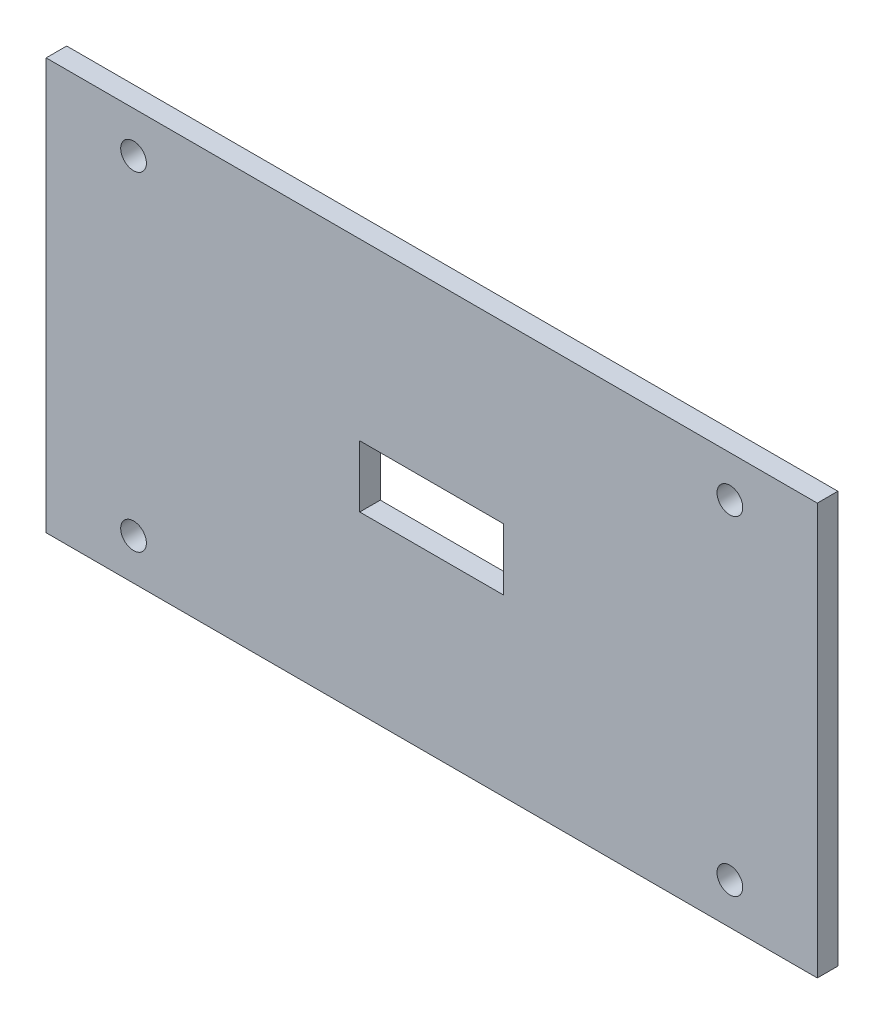
ISO-10303-21;
HEADER;
FILE_DESCRIPTION(('STEP AP214'),'2;1');
FILE_NAME('part.step','',(''),(''),'','','');
FILE_SCHEMA(('AUTOMOTIVE_DESIGN { 1 0 10303 214 1 1 1 1 }'));
ENDSEC;
DATA;
#1=APPLICATION_CONTEXT('core data for automotive mechanical design processes');
#2=APPLICATION_PROTOCOL_DEFINITION('international standard','automotive_design',2000,#1);
#3=PRODUCT_CONTEXT('',#1,'mechanical');
#4=PRODUCT('Part','Part','',(#3));
#5=PRODUCT_RELATED_PRODUCT_CATEGORY('part','',(#4));
#6=PRODUCT_DEFINITION_FORMATION('','',#4);
#7=PRODUCT_DEFINITION_CONTEXT('part definition',#1,'design');
#8=PRODUCT_DEFINITION('design','',#6,#7);
#9=PRODUCT_DEFINITION_SHAPE('','',#8);
#10=(LENGTH_UNIT() NAMED_UNIT(*) SI_UNIT(.MILLI.,.METRE.));
#11=(NAMED_UNIT(*) PLANE_ANGLE_UNIT() SI_UNIT($,.RADIAN.));
#12=(NAMED_UNIT(*) SI_UNIT($,.STERADIAN.) SOLID_ANGLE_UNIT());
#13=UNCERTAINTY_MEASURE_WITH_UNIT(LENGTH_MEASURE(1.E-05),#10,'distance_accuracy_value','');
#14=(GEOMETRIC_REPRESENTATION_CONTEXT(3) GLOBAL_UNCERTAINTY_ASSIGNED_CONTEXT((#13)) GLOBAL_UNIT_ASSIGNED_CONTEXT((#10,
#11,#12)) REPRESENTATION_CONTEXT('',''));
#15=CARTESIAN_POINT('',(0.,0.,0.));
#16=DIRECTION('',(0.,0.,1.));
#17=DIRECTION('',(1.,0.,0.));
#18=AXIS2_PLACEMENT_3D('',#15,#16,#17);
#19=CARTESIAN_POINT('',(0.,0.,4.));
#20=DIRECTION('',(0.,0.,1.));
#21=DIRECTION('',(1.,0.,0.));
#22=AXIS2_PLACEMENT_3D('',#19,#20,#21);
#23=PLANE('',#22);
#24=CARTESIAN_POINT('',(83.4442624253227,39.9499153350629,4.));
#25=DIRECTION('',(0.,0.,1.));
#26=DIRECTION('',(1.,0.,0.));
#27=AXIS2_PLACEMENT_3D('',#24,#25,#26);
#28=CIRCLE('',#27,2.50000000000001);
#29=CARTESIAN_POINT('',(85.9442624253228,39.9499153350629,4.));
#30=VERTEX_POINT('',#29);
#31=EDGE_CURVE('E127',#30,#30,#28,.T.);
#32=ORIENTED_EDGE('',*,*,#31,.F.);
#33=EDGE_LOOP('',(#32));
#34=FACE_BOUND('',#33,.T.);
#35=CARTESIAN_POINT('',(-32.5557375746772,39.9499153350629,4.));
#36=DIRECTION('',(0.,0.,1.));
#37=DIRECTION('',(1.,0.,0.));
#38=AXIS2_PLACEMENT_3D('',#35,#36,#37);
#39=CIRCLE('',#38,2.5);
#40=CARTESIAN_POINT('',(-30.0557375746772,39.9499153350629,4.));
#41=VERTEX_POINT('',#40);
#42=EDGE_CURVE('E143',#41,#41,#39,.T.);
#43=ORIENTED_EDGE('',*,*,#42,.F.);
#44=EDGE_LOOP('',(#43));
#45=FACE_BOUND('',#44,.T.);
#46=DIRECTION('',(0.,-1.,0.));
#47=VECTOR('',#46,1.);
#48=CARTESIAN_POINT('',(-49.5557375746772,47.9499153350629,4.));
#49=LINE('',#48,#47);
#50=CARTESIAN_POINT('',(-49.5557375746772,47.9499153350629,4.));
#51=VERTEX_POINT('',#50);
#52=CARTESIAN_POINT('',(-49.5557375746772,-32.0500846649371,4.));
#53=VERTEX_POINT('',#52);
#54=EDGE_CURVE('E149',#51,#53,#49,.T.);
#55=ORIENTED_EDGE('',*,*,#54,.T.);
#56=DIRECTION('',(1.,0.,0.));
#57=VECTOR('',#56,1.);
#58=CARTESIAN_POINT('',(-49.5557375746772,-32.0500846649371,4.));
#59=LINE('',#58,#57);
#60=CARTESIAN_POINT('',(100.444262425323,-32.0500846649371,4.));
#61=VERTEX_POINT('',#60);
#62=EDGE_CURVE('E152',#53,#61,#59,.T.);
#63=ORIENTED_EDGE('',*,*,#62,.T.);
#64=DIRECTION('',(0.,1.,0.));
#65=VECTOR('',#64,1.);
#66=CARTESIAN_POINT('',(100.444262425323,47.9499153350629,4.));
#67=LINE('',#66,#65);
#68=CARTESIAN_POINT('',(100.444262425323,47.9499153350629,4.));
#69=VERTEX_POINT('',#68);
#70=EDGE_CURVE('E155',#61,#69,#67,.T.);
#71=ORIENTED_EDGE('',*,*,#70,.T.);
#72=DIRECTION('',(-1.,0.,0.));
#73=VECTOR('',#72,1.);
#74=CARTESIAN_POINT('',(-49.5557375746772,47.9499153350629,4.));
#75=LINE('',#74,#73);
#76=EDGE_CURVE('E157',#69,#51,#75,.T.);
#77=ORIENTED_EDGE('',*,*,#76,.T.);
#78=EDGE_LOOP('',(#55,#63,#71,#77));
#79=FACE_BOUND('',#78,.T.);
#80=CARTESIAN_POINT('',(-32.5557375746772,-24.0500846649371,4.));
#81=DIRECTION('',(0.,0.,1.));
#82=DIRECTION('',(1.,0.,0.));
#83=AXIS2_PLACEMENT_3D('',#80,#81,#82);
#84=CIRCLE('',#83,2.5);
#85=CARTESIAN_POINT('',(-30.0557375746772,-24.0500846649371,4.));
#86=VERTEX_POINT('',#85);
#87=EDGE_CURVE('E137',#86,#86,#84,.T.);
#88=ORIENTED_EDGE('',*,*,#87,.F.);
#89=EDGE_LOOP('',(#88));
#90=FACE_BOUND('',#89,.T.);
#91=DIRECTION('',(1.,0.,0.));
#92=VECTOR('',#91,1.);
#93=CARTESIAN_POINT('',(11.4442624253228,1.94991533506287,4.));
#94=LINE('',#93,#92);
#95=CARTESIAN_POINT('',(11.4442624253228,1.94991533506287,4.));
#96=VERTEX_POINT('',#95);
#97=CARTESIAN_POINT('',(39.4442624253228,1.94991533506287,4.));
#98=VERTEX_POINT('',#97);
#99=EDGE_CURVE('E106',#96,#98,#94,.T.);
#100=ORIENTED_EDGE('',*,*,#99,.F.);
#101=DIRECTION('',(0.,-1.,0.));
#102=VECTOR('',#101,1.);
#103=CARTESIAN_POINT('',(11.4442624253228,13.9499153350629,4.));
#104=LINE('',#103,#102);
#105=CARTESIAN_POINT('',(11.4442624253228,13.9499153350629,4.));
#106=VERTEX_POINT('',#105);
#107=EDGE_CURVE('E98',#106,#96,#104,.T.);
#108=ORIENTED_EDGE('',*,*,#107,.F.);
#109=DIRECTION('',(-1.,0.,0.));
#110=VECTOR('',#109,1.);
#111=CARTESIAN_POINT('',(11.4442624253228,13.9499153350629,4.));
#112=LINE('',#111,#110);
#113=CARTESIAN_POINT('',(39.4442624253228,13.9499153350629,4.));
#114=VERTEX_POINT('',#113);
#115=EDGE_CURVE('E121',#114,#106,#112,.T.);
#116=ORIENTED_EDGE('',*,*,#115,.F.);
#117=DIRECTION('',(0.,1.,0.));
#118=VECTOR('',#117,1.);
#119=CARTESIAN_POINT('',(39.4442624253228,13.9499153350629,4.));
#120=LINE('',#119,#118);
#121=EDGE_CURVE('E119',#98,#114,#120,.T.);
#122=ORIENTED_EDGE('',*,*,#121,.F.);
#123=EDGE_LOOP('',(#100,#108,#116,#122));
#124=FACE_BOUND('',#123,.T.);
#125=CARTESIAN_POINT('',(83.4442624253227,-24.0500846649371,4.));
#126=DIRECTION('',(0.,0.,1.));
#127=DIRECTION('',(1.,0.,0.));
#128=AXIS2_PLACEMENT_3D('',#125,#126,#127);
#129=CIRCLE('',#128,2.49999999999999);
#130=CARTESIAN_POINT('',(85.9442624253227,-24.0500846649371,4.));
#131=VERTEX_POINT('',#130);
#132=EDGE_CURVE('E255',#131,#131,#129,.T.);
#133=ORIENTED_EDGE('',*,*,#132,.F.);
#134=EDGE_LOOP('',(#133));
#135=FACE_BOUND('',#134,.T.);
#136=ADVANCED_FACE('F33',(#34,#45,#79,#90,#124,#135),#23,.T.);
#137=CARTESIAN_POINT('',(0.,0.,0.));
#138=DIRECTION('',(0.,0.,1.));
#139=DIRECTION('',(1.,0.,0.));
#140=AXIS2_PLACEMENT_3D('',#137,#138,#139);
#141=PLANE('',#140);
#142=CARTESIAN_POINT('',(-32.5557375746772,-24.0500846649371,0.));
#143=DIRECTION('',(0.,0.,1.));
#144=DIRECTION('',(1.,0.,0.));
#145=AXIS2_PLACEMENT_3D('',#142,#143,#144);
#146=CIRCLE('',#145,2.5);
#147=CARTESIAN_POINT('',(-30.0557375746772,-24.0500846649371,0.));
#148=VERTEX_POINT('',#147);
#149=EDGE_CURVE('E114',#148,#148,#146,.T.);
#150=ORIENTED_EDGE('',*,*,#149,.T.);
#151=EDGE_LOOP('',(#150));
#152=FACE_BOUND('',#151,.T.);
#153=CARTESIAN_POINT('',(-32.5557375746772,39.9499153350629,0.));
#154=DIRECTION('',(0.,0.,1.));
#155=DIRECTION('',(1.,0.,0.));
#156=AXIS2_PLACEMENT_3D('',#153,#154,#155);
#157=CIRCLE('',#156,2.5);
#158=CARTESIAN_POINT('',(-30.0557375746772,39.9499153350629,0.));
#159=VERTEX_POINT('',#158);
#160=EDGE_CURVE('E140',#159,#159,#157,.T.);
#161=ORIENTED_EDGE('',*,*,#160,.T.);
#162=EDGE_LOOP('',(#161));
#163=FACE_BOUND('',#162,.T.);
#164=DIRECTION('',(0.,-1.,0.));
#165=VECTOR('',#164,1.);
#166=CARTESIAN_POINT('',(-49.5557375746772,47.9499153350629,0.));
#167=LINE('',#166,#165);
#168=CARTESIAN_POINT('',(-49.5557375746772,47.9499153350629,0.));
#169=VERTEX_POINT('',#168);
#170=CARTESIAN_POINT('',(-49.5557375746772,-32.0500846649371,0.));
#171=VERTEX_POINT('',#170);
#172=EDGE_CURVE('E146',#169,#171,#167,.T.);
#173=ORIENTED_EDGE('',*,*,#172,.F.);
#174=DIRECTION('',(-1.,0.,0.));
#175=VECTOR('',#174,1.);
#176=CARTESIAN_POINT('',(-49.5557375746772,47.9499153350629,0.));
#177=LINE('',#176,#175);
#178=CARTESIAN_POINT('',(100.444262425323,47.9499153350629,0.));
#179=VERTEX_POINT('',#178);
#180=EDGE_CURVE('E153',#179,#169,#177,.T.);
#181=ORIENTED_EDGE('',*,*,#180,.F.);
#182=DIRECTION('',(0.,1.,0.));
#183=VECTOR('',#182,1.);
#184=CARTESIAN_POINT('',(100.444262425323,47.9499153350629,0.));
#185=LINE('',#184,#183);
#186=CARTESIAN_POINT('',(100.444262425323,-32.0500846649371,0.));
#187=VERTEX_POINT('',#186);
#188=EDGE_CURVE('E164',#187,#179,#185,.T.);
#189=ORIENTED_EDGE('',*,*,#188,.F.);
#190=DIRECTION('',(1.,0.,0.));
#191=VECTOR('',#190,1.);
#192=CARTESIAN_POINT('',(-49.5557375746772,-32.0500846649371,0.));
#193=LINE('',#192,#191);
#194=EDGE_CURVE('E162',#171,#187,#193,.T.);
#195=ORIENTED_EDGE('',*,*,#194,.F.);
#196=EDGE_LOOP('',(#173,#181,#189,#195));
#197=FACE_BOUND('',#196,.T.);
#198=DIRECTION('',(0.,-1.,0.));
#199=VECTOR('',#198,1.);
#200=CARTESIAN_POINT('',(11.4442624253228,13.9499153350629,0.));
#201=LINE('',#200,#199);
#202=CARTESIAN_POINT('',(11.4442624253228,13.9499153350629,0.));
#203=VERTEX_POINT('',#202);
#204=CARTESIAN_POINT('',(11.4442624253228,1.94991533506287,0.));
#205=VERTEX_POINT('',#204);
#206=EDGE_CURVE('E56',#203,#205,#201,.T.);
#207=ORIENTED_EDGE('',*,*,#206,.T.);
#208=DIRECTION('',(1.,0.,0.));
#209=VECTOR('',#208,1.);
#210=CARTESIAN_POINT('',(11.4442624253228,1.94991533506287,0.));
#211=LINE('',#210,#209);
#212=CARTESIAN_POINT('',(39.4442624253228,1.94991533506287,0.));
#213=VERTEX_POINT('',#212);
#214=EDGE_CURVE('E113',#205,#213,#211,.T.);
#215=ORIENTED_EDGE('',*,*,#214,.T.);
#216=DIRECTION('',(0.,1.,0.));
#217=VECTOR('',#216,1.);
#218=CARTESIAN_POINT('',(39.4442624253228,13.9499153350629,0.));
#219=LINE('',#218,#217);
#220=CARTESIAN_POINT('',(39.4442624253228,13.9499153350629,0.));
#221=VERTEX_POINT('',#220);
#222=EDGE_CURVE('E129',#213,#221,#219,.T.);
#223=ORIENTED_EDGE('',*,*,#222,.T.);
#224=DIRECTION('',(-1.,0.,0.));
#225=VECTOR('',#224,1.);
#226=CARTESIAN_POINT('',(11.4442624253228,13.9499153350629,0.));
#227=LINE('',#226,#225);
#228=EDGE_CURVE('E107',#221,#203,#227,.T.);
#229=ORIENTED_EDGE('',*,*,#228,.T.);
#230=EDGE_LOOP('',(#207,#215,#223,#229));
#231=FACE_BOUND('',#230,.T.);
#232=CARTESIAN_POINT('',(83.4442624253227,39.9499153350629,0.));
#233=DIRECTION('',(0.,0.,1.));
#234=DIRECTION('',(1.,0.,0.));
#235=AXIS2_PLACEMENT_3D('',#232,#233,#234);
#236=CIRCLE('',#235,2.50000000000001);
#237=CARTESIAN_POINT('',(85.9442624253228,39.9499153350629,0.));
#238=VERTEX_POINT('',#237);
#239=EDGE_CURVE('E261',#238,#238,#236,.T.);
#240=ORIENTED_EDGE('',*,*,#239,.T.);
#241=EDGE_LOOP('',(#240));
#242=FACE_BOUND('',#241,.T.);
#243=CARTESIAN_POINT('',(83.4442624253227,-24.0500846649371,0.));
#244=DIRECTION('',(0.,0.,1.));
#245=DIRECTION('',(1.,0.,0.));
#246=AXIS2_PLACEMENT_3D('',#243,#244,#245);
#247=CIRCLE('',#246,2.49999999999999);
#248=CARTESIAN_POINT('',(85.9442624253227,-24.0500846649371,0.));
#249=VERTEX_POINT('',#248);
#250=EDGE_CURVE('E258',#249,#249,#247,.T.);
#251=ORIENTED_EDGE('',*,*,#250,.T.);
#252=EDGE_LOOP('',(#251));
#253=FACE_BOUND('',#252,.T.);
#254=ADVANCED_FACE('F182',(#152,#163,#197,#231,#242,#253),#141,.F.);
#255=CARTESIAN_POINT('',(-49.5557375746772,47.9499153350629,4.));
#256=DIRECTION('',(1.,0.,0.));
#257=DIRECTION('',(0.,1.,0.));
#258=AXIS2_PLACEMENT_3D('',#255,#256,#257);
#259=PLANE('',#258);
#260=ORIENTED_EDGE('',*,*,#172,.T.);
#261=DIRECTION('',(0.,0.,-1.));
#262=VECTOR('',#261,1.);
#263=CARTESIAN_POINT('',(-49.5557375746772,-32.0500846649371,4.));
#264=LINE('',#263,#262);
#265=EDGE_CURVE('E11',#53,#171,#264,.T.);
#266=ORIENTED_EDGE('',*,*,#265,.F.);
#267=ORIENTED_EDGE('',*,*,#54,.F.);
#268=DIRECTION('',(0.,0.,-1.));
#269=VECTOR('',#268,1.);
#270=CARTESIAN_POINT('',(-49.5557375746772,47.9499153350629,4.));
#271=LINE('',#270,#269);
#272=EDGE_CURVE('E159',#51,#169,#271,.T.);
#273=ORIENTED_EDGE('',*,*,#272,.T.);
#274=EDGE_LOOP('',(#260,#266,#267,#273));
#275=FACE_BOUND('',#274,.T.);
#276=ADVANCED_FACE('F35',(#275),#259,.F.);
#277=CARTESIAN_POINT('',(-49.5557375746772,-32.0500846649371,4.));
#278=DIRECTION('',(0.,1.,0.));
#279=DIRECTION('',(0.,0.,1.));
#280=AXIS2_PLACEMENT_3D('',#277,#278,#279);
#281=PLANE('',#280);
#282=ORIENTED_EDGE('',*,*,#194,.T.);
#283=DIRECTION('',(0.,0.,-1.));
#284=VECTOR('',#283,1.);
#285=CARTESIAN_POINT('',(100.444262425323,-32.0500846649371,4.));
#286=LINE('',#285,#284);
#287=EDGE_CURVE('E41',#61,#187,#286,.T.);
#288=ORIENTED_EDGE('',*,*,#287,.F.);
#289=ORIENTED_EDGE('',*,*,#62,.F.);
#290=ORIENTED_EDGE('',*,*,#265,.T.);
#291=EDGE_LOOP('',(#282,#288,#289,#290));
#292=FACE_BOUND('',#291,.T.);
#293=ADVANCED_FACE('F193',(#292),#281,.F.);
#294=CARTESIAN_POINT('',(100.444262425323,47.9499153350629,4.));
#295=DIRECTION('',(-1.,0.,0.));
#296=DIRECTION('',(0.,-1.,0.));
#297=AXIS2_PLACEMENT_3D('',#294,#295,#296);
#298=PLANE('',#297);
#299=ORIENTED_EDGE('',*,*,#188,.T.);
#300=DIRECTION('',(0.,0.,-1.));
#301=VECTOR('',#300,1.);
#302=CARTESIAN_POINT('',(100.444262425323,47.9499153350629,4.));
#303=LINE('',#302,#301);
#304=EDGE_CURVE('E169',#69,#179,#303,.T.);
#305=ORIENTED_EDGE('',*,*,#304,.F.);
#306=ORIENTED_EDGE('',*,*,#70,.F.);
#307=ORIENTED_EDGE('',*,*,#287,.T.);
#308=EDGE_LOOP('',(#299,#305,#306,#307));
#309=FACE_BOUND('',#308,.T.);
#310=ADVANCED_FACE('F176',(#309),#298,.F.);
#311=CARTESIAN_POINT('',(-49.5557375746772,47.9499153350629,4.));
#312=DIRECTION('',(0.,-1.,0.));
#313=DIRECTION('',(1.,0.,0.));
#314=AXIS2_PLACEMENT_3D('',#311,#312,#313);
#315=PLANE('',#314);
#316=ORIENTED_EDGE('',*,*,#180,.T.);
#317=ORIENTED_EDGE('',*,*,#272,.F.);
#318=ORIENTED_EDGE('',*,*,#76,.F.);
#319=ORIENTED_EDGE('',*,*,#304,.T.);
#320=EDGE_LOOP('',(#316,#317,#318,#319));
#321=FACE_BOUND('',#320,.T.);
#322=ADVANCED_FACE('F186',(#321),#315,.F.);
#323=CARTESIAN_POINT('',(-32.5557375746772,39.9499153350629,4.));
#324=DIRECTION('',(0.,0.,-1.));
#325=DIRECTION('',(-1.,0.,0.));
#326=AXIS2_PLACEMENT_3D('',#323,#324,#325);
#327=CYLINDRICAL_SURFACE('',#326,2.5);
#328=ORIENTED_EDGE('',*,*,#42,.T.);
#329=EDGE_LOOP('',(#328));
#330=FACE_BOUND('',#329,.T.);
#331=ORIENTED_EDGE('',*,*,#160,.F.);
#332=EDGE_LOOP('',(#331));
#333=FACE_BOUND('',#332,.T.);
#334=ADVANCED_FACE('F211',(#330,#333),#327,.F.);
#335=CARTESIAN_POINT('',(-32.5557375746772,-24.0500846649371,4.));
#336=DIRECTION('',(0.,0.,-1.));
#337=DIRECTION('',(-1.,0.,0.));
#338=AXIS2_PLACEMENT_3D('',#335,#336,#337);
#339=CYLINDRICAL_SURFACE('',#338,2.5);
#340=ORIENTED_EDGE('',*,*,#87,.T.);
#341=EDGE_LOOP('',(#340));
#342=FACE_BOUND('',#341,.T.);
#343=ORIENTED_EDGE('',*,*,#149,.F.);
#344=EDGE_LOOP('',(#343));
#345=FACE_BOUND('',#344,.T.);
#346=ADVANCED_FACE('F218',(#342,#345),#339,.F.);
#347=CARTESIAN_POINT('',(11.4442624253228,13.9499153350629,4.));
#348=DIRECTION('',(1.,0.,0.));
#349=DIRECTION('',(0.,1.,0.));
#350=AXIS2_PLACEMENT_3D('',#347,#348,#349);
#351=PLANE('',#350);
#352=ORIENTED_EDGE('',*,*,#206,.F.);
#353=DIRECTION('',(0.,0.,-1.));
#354=VECTOR('',#353,1.);
#355=CARTESIAN_POINT('',(11.4442624253228,13.9499153350629,4.));
#356=LINE('',#355,#354);
#357=EDGE_CURVE('E102',#106,#203,#356,.T.);
#358=ORIENTED_EDGE('',*,*,#357,.F.);
#359=ORIENTED_EDGE('',*,*,#107,.T.);
#360=DIRECTION('',(0.,0.,-1.));
#361=VECTOR('',#360,1.);
#362=CARTESIAN_POINT('',(11.4442624253228,1.94991533506287,4.));
#363=LINE('',#362,#361);
#364=EDGE_CURVE('E101',#96,#205,#363,.T.);
#365=ORIENTED_EDGE('',*,*,#364,.T.);
#366=EDGE_LOOP('',(#352,#358,#359,#365));
#367=FACE_BOUND('',#366,.T.);
#368=ADVANCED_FACE('F100',(#367),#351,.T.);
#369=CARTESIAN_POINT('',(11.4442624253228,1.94991533506287,4.));
#370=DIRECTION('',(0.,1.,0.));
#371=DIRECTION('',(0.,0.,1.));
#372=AXIS2_PLACEMENT_3D('',#369,#370,#371);
#373=PLANE('',#372);
#374=ORIENTED_EDGE('',*,*,#214,.F.);
#375=ORIENTED_EDGE('',*,*,#364,.F.);
#376=ORIENTED_EDGE('',*,*,#99,.T.);
#377=DIRECTION('',(0.,0.,-1.));
#378=VECTOR('',#377,1.);
#379=CARTESIAN_POINT('',(39.4442624253228,1.94991533506287,4.));
#380=LINE('',#379,#378);
#381=EDGE_CURVE('E115',#98,#213,#380,.T.);
#382=ORIENTED_EDGE('',*,*,#381,.T.);
#383=EDGE_LOOP('',(#374,#375,#376,#382));
#384=FACE_BOUND('',#383,.T.);
#385=ADVANCED_FACE('F110',(#384),#373,.T.);
#386=CARTESIAN_POINT('',(39.4442624253228,13.9499153350629,4.));
#387=DIRECTION('',(-1.,0.,0.));
#388=DIRECTION('',(0.,0.,1.));
#389=AXIS2_PLACEMENT_3D('',#386,#387,#388);
#390=PLANE('',#389);
#391=ORIENTED_EDGE('',*,*,#222,.F.);
#392=ORIENTED_EDGE('',*,*,#381,.F.);
#393=ORIENTED_EDGE('',*,*,#121,.T.);
#394=DIRECTION('',(0.,0.,-1.));
#395=VECTOR('',#394,1.);
#396=CARTESIAN_POINT('',(39.4442624253228,13.9499153350629,4.));
#397=LINE('',#396,#395);
#398=EDGE_CURVE('E48',#114,#221,#397,.T.);
#399=ORIENTED_EDGE('',*,*,#398,.T.);
#400=EDGE_LOOP('',(#391,#392,#393,#399));
#401=FACE_BOUND('',#400,.T.);
#402=ADVANCED_FACE('F236',(#401),#390,.T.);
#403=CARTESIAN_POINT('',(11.4442624253228,13.9499153350629,4.));
#404=DIRECTION('',(0.,-1.,0.));
#405=DIRECTION('',(1.,0.,0.));
#406=AXIS2_PLACEMENT_3D('',#403,#404,#405);
#407=PLANE('',#406);
#408=ORIENTED_EDGE('',*,*,#228,.F.);
#409=ORIENTED_EDGE('',*,*,#398,.F.);
#410=ORIENTED_EDGE('',*,*,#115,.T.);
#411=ORIENTED_EDGE('',*,*,#357,.T.);
#412=EDGE_LOOP('',(#408,#409,#410,#411));
#413=FACE_BOUND('',#412,.T.);
#414=ADVANCED_FACE('F239',(#413),#407,.T.);
#415=CARTESIAN_POINT('',(83.4442624253227,39.9499153350629,4.));
#416=DIRECTION('',(0.,0.,-1.));
#417=DIRECTION('',(-1.,0.,0.));
#418=AXIS2_PLACEMENT_3D('',#415,#416,#417);
#419=CYLINDRICAL_SURFACE('',#418,2.50000000000001);
#420=ORIENTED_EDGE('',*,*,#31,.T.);
#421=EDGE_LOOP('',(#420));
#422=FACE_BOUND('',#421,.T.);
#423=ORIENTED_EDGE('',*,*,#239,.F.);
#424=EDGE_LOOP('',(#423));
#425=FACE_BOUND('',#424,.T.);
#426=ADVANCED_FACE('F243',(#422,#425),#419,.F.);
#427=CARTESIAN_POINT('',(83.4442624253227,-24.0500846649371,4.));
#428=DIRECTION('',(0.,0.,-1.));
#429=DIRECTION('',(-1.,0.,0.));
#430=AXIS2_PLACEMENT_3D('',#427,#428,#429);
#431=CYLINDRICAL_SURFACE('',#430,2.49999999999999);
#432=ORIENTED_EDGE('',*,*,#132,.T.);
#433=EDGE_LOOP('',(#432));
#434=FACE_BOUND('',#433,.T.);
#435=ORIENTED_EDGE('',*,*,#250,.F.);
#436=EDGE_LOOP('',(#435));
#437=FACE_BOUND('',#436,.T.);
#438=ADVANCED_FACE('F246',(#434,#437),#431,.F.);
#439=CLOSED_SHELL('',(#136,#254,#276,#293,#310,#322,#334,#346,#368,#385,#402,#414,#426,#438));
#440=MANIFOLD_SOLID_BREP('B2',#439);
#441=ADVANCED_BREP_SHAPE_REPRESENTATION('',(#18,#440),#14);
#442=SHAPE_DEFINITION_REPRESENTATION(#9,#441);
ENDSEC;
END-ISO-10303-21;
